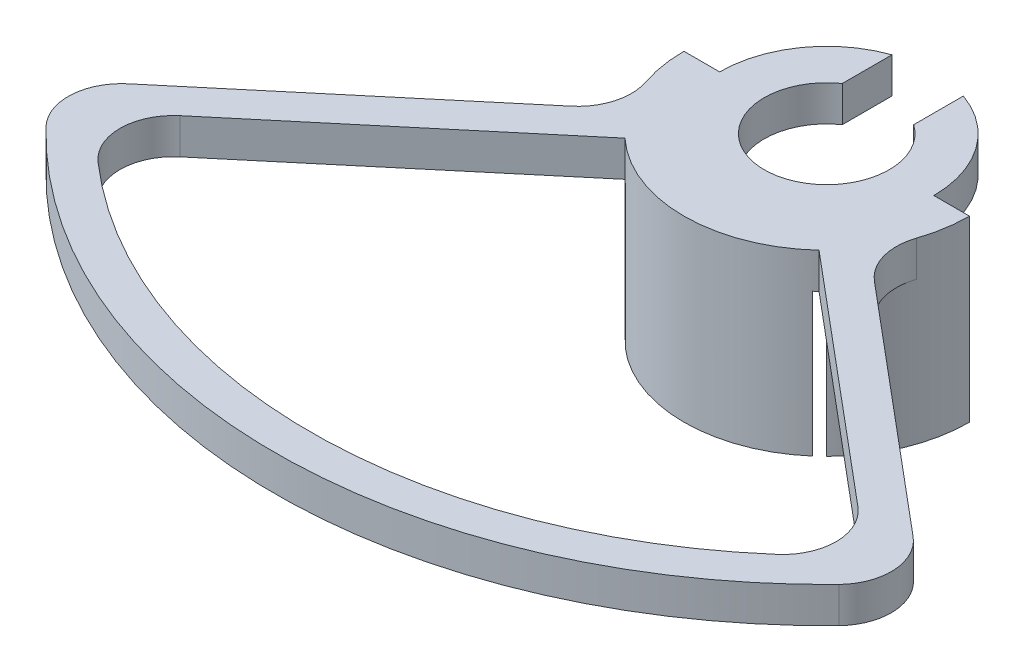
ISO-10303-21;
HEADER;
FILE_DESCRIPTION(('STEP AP214'),'2;1');
FILE_NAME('part.step','',(''),(''),'','','');
FILE_SCHEMA(('AUTOMOTIVE_DESIGN { 1 0 10303 214 1 1 1 1 }'));
ENDSEC;
DATA;
#1=APPLICATION_CONTEXT('core data for automotive mechanical design processes');
#2=APPLICATION_PROTOCOL_DEFINITION('international standard','automotive_design',2000,#1);
#3=PRODUCT_CONTEXT('',#1,'mechanical');
#4=PRODUCT('Part','Part','',(#3));
#5=PRODUCT_RELATED_PRODUCT_CATEGORY('part','',(#4));
#6=PRODUCT_DEFINITION_FORMATION('','',#4);
#7=PRODUCT_DEFINITION_CONTEXT('part definition',#1,'design');
#8=PRODUCT_DEFINITION('design','',#6,#7);
#9=PRODUCT_DEFINITION_SHAPE('','',#8);
#10=(LENGTH_UNIT() NAMED_UNIT(*) SI_UNIT(.MILLI.,.METRE.));
#11=(NAMED_UNIT(*) PLANE_ANGLE_UNIT() SI_UNIT($,.RADIAN.));
#12=(NAMED_UNIT(*) SI_UNIT($,.STERADIAN.) SOLID_ANGLE_UNIT());
#13=UNCERTAINTY_MEASURE_WITH_UNIT(LENGTH_MEASURE(1.E-05),#10,'distance_accuracy_value','');
#14=(GEOMETRIC_REPRESENTATION_CONTEXT(3) GLOBAL_UNCERTAINTY_ASSIGNED_CONTEXT((#13)) GLOBAL_UNIT_ASSIGNED_CONTEXT((#10,
#11,#12)) REPRESENTATION_CONTEXT('',''));
#15=CARTESIAN_POINT('',(0.,0.,0.));
#16=DIRECTION('',(0.,0.,1.));
#17=DIRECTION('',(1.,0.,0.));
#18=AXIS2_PLACEMENT_3D('',#15,#16,#17);
#19=CARTESIAN_POINT('',(-21.508214624942,2.,19.3529422484028));
#20=DIRECTION('',(0.642787609686538,0.,0.766044443118979));
#21=DIRECTION('',(0.766044443118979,0.,-0.642787609686538));
#22=AXIS2_PLACEMENT_3D('',#19,#20,#21);
#23=PLANE('',#22);
#24=DIRECTION('',(-0.766044443118979,0.,0.642787609686538));
#25=VECTOR('',#24,1.);
#26=CARTESIAN_POINT('',(-21.508214624942,2.,19.3529422484028));
#27=LINE('',#26,#25);
#28=CARTESIAN_POINT('',(-5.43750165946081,2.,5.86801292631168));
#29=VERTEX_POINT('',#28);
#30=CARTESIAN_POINT('',(-18.9855892592477,2.,17.2362082344503));
#31=VERTEX_POINT('',#30);
#32=EDGE_CURVE('E273',#29,#31,#27,.T.);
#33=ORIENTED_EDGE('',*,*,#32,.T.);
#34=DIRECTION('',(0.,1.,0.));
#35=VECTOR('',#34,1.);
#36=CARTESIAN_POINT('',(-18.9855892592477,0.,17.2362082344503));
#37=LINE('',#36,#35);
#38=CARTESIAN_POINT('',(-18.9855892592477,0.,17.2362082344503));
#39=VERTEX_POINT('',#38);
#40=EDGE_CURVE('E423',#31,#39,#37,.F.);
#41=ORIENTED_EDGE('',*,*,#40,.T.);
#42=DIRECTION('',(-0.766044443118979,0.,0.642787609686538));
#43=VECTOR('',#42,1.);
#44=CARTESIAN_POINT('',(-21.508214624942,0.,19.3529422484028));
#45=LINE('',#44,#43);
#46=CARTESIAN_POINT('',(-5.43750165946081,0.,5.86801292631168));
#47=VERTEX_POINT('',#46);
#48=EDGE_CURVE('E276',#47,#39,#45,.T.);
#49=ORIENTED_EDGE('',*,*,#48,.F.);
#50=DIRECTION('',(0.,-1.,0.));
#51=VECTOR('',#50,1.);
#52=CARTESIAN_POINT('',(-5.43750165946081,19.8885438199983,5.86801292631168));
#53=LINE('',#52,#51);
#54=EDGE_CURVE('E258',#47,#29,#53,.F.);
#55=ORIENTED_EDGE('',*,*,#54,.T.);
#56=EDGE_LOOP('',(#33,#41,#49,#55));
#57=FACE_BOUND('',#56,.T.);
#58=ADVANCED_FACE('F43',(#57),#23,.T.);
#59=CARTESIAN_POINT('',(21.508214624942,2.,19.3529422484028));
#60=DIRECTION('',(-0.642787609686538,0.,0.766044443118979));
#61=DIRECTION('',(0.766044443118979,0.,0.642787609686538));
#62=AXIS2_PLACEMENT_3D('',#59,#60,#61);
#63=PLANE('',#62);
#64=DIRECTION('',(-0.766044443118979,0.,-0.642787609686538));
#65=VECTOR('',#64,1.);
#66=CARTESIAN_POINT('',(21.508214624942,0.,19.3529422484028));
#67=LINE('',#66,#65);
#68=CARTESIAN_POINT('',(18.9855892592477,0.,17.2362082344503));
#69=VERTEX_POINT('',#68);
#70=CARTESIAN_POINT('',(5.43750165946081,0.,5.86801292631167));
#71=VERTEX_POINT('',#70);
#72=EDGE_CURVE('E285',#69,#71,#67,.T.);
#73=ORIENTED_EDGE('',*,*,#72,.F.);
#74=DIRECTION('',(0.,1.,0.));
#75=VECTOR('',#74,1.);
#76=CARTESIAN_POINT('',(18.9855892592477,2.,17.2362082344503));
#77=LINE('',#76,#75);
#78=CARTESIAN_POINT('',(18.9855892592477,2.,17.2362082344503));
#79=VERTEX_POINT('',#78);
#80=EDGE_CURVE('E433',#69,#79,#77,.T.);
#81=ORIENTED_EDGE('',*,*,#80,.T.);
#82=DIRECTION('',(-0.766044443118979,0.,-0.642787609686538));
#83=VECTOR('',#82,1.);
#84=CARTESIAN_POINT('',(21.508214624942,2.,19.3529422484028));
#85=LINE('',#84,#83);
#86=CARTESIAN_POINT('',(5.43750165946081,2.,5.86801292631167));
#87=VERTEX_POINT('',#86);
#88=EDGE_CURVE('E290',#79,#87,#85,.T.);
#89=ORIENTED_EDGE('',*,*,#88,.T.);
#90=DIRECTION('',(0.,-1.,0.));
#91=VECTOR('',#90,1.);
#92=CARTESIAN_POINT('',(5.43750165946081,19.8885438199983,5.86801292631167));
#93=LINE('',#92,#91);
#94=EDGE_CURVE('E262',#87,#71,#93,.T.);
#95=ORIENTED_EDGE('',*,*,#94,.T.);
#96=EDGE_LOOP('',(#73,#81,#89,#95));
#97=FACE_BOUND('',#96,.T.);
#98=ADVANCED_FACE('F685',(#97),#63,.T.);
#99=CARTESIAN_POINT('',(-3.74139683240488,13.0516361435528,4.56201158947133));
#100=DIRECTION('',(0.698202808595969,0.,0.715900019603786));
#101=DIRECTION('',(0.715900019603786,0.,-0.698202808595969));
#102=AXIS2_PLACEMENT_3D('',#99,#100,#101);
#103=PLANE('',#102);
#104=DIRECTION('',(0.,-1.,0.));
#105=VECTOR('',#104,1.);
#106=CARTESIAN_POINT('',(-5.25164015186098,13.0516361435528,6.0349213512159));
#107=LINE('',#106,#105);
#108=CARTESIAN_POINT('',(-5.25164015186098,0.,6.0349213512159));
#109=VERTEX_POINT('',#108);
#110=CARTESIAN_POINT('',(-5.25164015186098,-8.,6.0349213512159));
#111=VERTEX_POINT('',#110);
#112=EDGE_CURVE('E651',#109,#111,#107,.T.);
#113=ORIENTED_EDGE('',*,*,#112,.F.);
#114=DIRECTION('',(0.715900019603786,0.,-0.698202808595969));
#115=VECTOR('',#114,1.);
#116=CARTESIAN_POINT('',(0.456408480129121,0.,0.46797697724652));
#117=LINE('',#116,#115);
#118=CARTESIAN_POINT('',(-3.74139683240488,0.,4.56201158947133));
#119=VERTEX_POINT('',#118);
#120=EDGE_CURVE('E625',#109,#119,#117,.T.);
#121=ORIENTED_EDGE('',*,*,#120,.T.);
#122=DIRECTION('',(0.,-1.,0.));
#123=VECTOR('',#122,1.);
#124=CARTESIAN_POINT('',(-3.74139683240488,13.0516361435528,4.56201158947133));
#125=LINE('',#124,#123);
#126=CARTESIAN_POINT('',(-3.74139683240488,-8.,4.56201158947133));
#127=VERTEX_POINT('',#126);
#128=EDGE_CURVE('E648',#119,#127,#125,.T.);
#129=ORIENTED_EDGE('',*,*,#128,.T.);
#130=DIRECTION('',(-0.715900019603786,0.,0.698202808595969));
#131=VECTOR('',#130,1.);
#132=CARTESIAN_POINT('',(-3.74139683240488,-8.,4.56201158947133));
#133=LINE('',#132,#131);
#134=EDGE_CURVE('E635',#127,#111,#133,.T.);
#135=ORIENTED_EDGE('',*,*,#134,.T.);
#136=EDGE_LOOP('',(#113,#121,#129,#135));
#137=FACE_BOUND('',#136,.T.);
#138=ADVANCED_FACE('F669',(#137),#103,.F.);
#139=CARTESIAN_POINT('',(3.74139683240488,13.0516361435528,4.56201158947133));
#140=DIRECTION('',(-0.698202808595969,0.,0.715900019603786));
#141=DIRECTION('',(0.715900019603786,0.,0.698202808595969));
#142=AXIS2_PLACEMENT_3D('',#139,#140,#141);
#143=PLANE('',#142);
#144=DIRECTION('',(0.715900019603786,0.,0.698202808595969));
#145=VECTOR('',#144,1.);
#146=CARTESIAN_POINT('',(-0.456408480129121,0.,0.46797697724652));
#147=LINE('',#146,#145);
#148=CARTESIAN_POINT('',(3.74139683240488,0.,4.56201158947133));
#149=VERTEX_POINT('',#148);
#150=CARTESIAN_POINT('',(5.25164015186098,0.,6.0349213512159));
#151=VERTEX_POINT('',#150);
#152=EDGE_CURVE('E628',#149,#151,#147,.T.);
#153=ORIENTED_EDGE('',*,*,#152,.T.);
#154=DIRECTION('',(0.,-1.,0.));
#155=VECTOR('',#154,1.);
#156=CARTESIAN_POINT('',(5.25164015186098,13.0516361435528,6.0349213512159));
#157=LINE('',#156,#155);
#158=CARTESIAN_POINT('',(5.25164015186098,-8.,6.0349213512159));
#159=VERTEX_POINT('',#158);
#160=EDGE_CURVE('E267',#151,#159,#157,.T.);
#161=ORIENTED_EDGE('',*,*,#160,.T.);
#162=DIRECTION('',(-0.715900019603786,0.,-0.698202808595969));
#163=VECTOR('',#162,1.);
#164=CARTESIAN_POINT('',(3.74139683240488,-8.,4.56201158947133));
#165=LINE('',#164,#163);
#166=CARTESIAN_POINT('',(3.74139683240488,-8.,4.56201158947133));
#167=VERTEX_POINT('',#166);
#168=EDGE_CURVE('E643',#159,#167,#165,.T.);
#169=ORIENTED_EDGE('',*,*,#168,.T.);
#170=DIRECTION('',(0.,-1.,0.));
#171=VECTOR('',#170,1.);
#172=CARTESIAN_POINT('',(3.74139683240488,13.0516361435528,4.56201158947133));
#173=LINE('',#172,#171);
#174=EDGE_CURVE('E646',#149,#167,#173,.T.);
#175=ORIENTED_EDGE('',*,*,#174,.F.);
#176=EDGE_LOOP('',(#153,#161,#169,#175));
#177=FACE_BOUND('',#176,.T.);
#178=ADVANCED_FACE('F681',(#177),#143,.F.);
#179=CARTESIAN_POINT('',(0.,0.,0.));
#180=DIRECTION('',(0.,1.,0.));
#181=DIRECTION('',(0.,0.,1.));
#182=AXIS2_PLACEMENT_3D('',#179,#180,#181);
#183=PLANE('',#182);
#184=DIRECTION('',(-0.766044443118979,0.,-0.642787609686537));
#185=VECTOR('',#184,1.);
#186=CARTESIAN_POINT('',(24.325878730553,0.,19.1064285815379));
#187=LINE('',#186,#185);
#188=CARTESIAN_POINT('',(21.9852105926654,0.,17.142374810328));
#189=VERTEX_POINT('',#188);
#190=CARTESIAN_POINT('',(8.49240730286366,0.,5.82056854630783));
#191=VERTEX_POINT('',#190);
#192=EDGE_CURVE('E347',#189,#191,#187,.T.);
#193=ORIENTED_EDGE('',*,*,#192,.F.);
#194=CARTESIAN_POINT('',(20.0568477636058,0.,19.4405081396849));
#195=DIRECTION('',(0.,1.,0.));
#196=DIRECTION('',(0.,0.,1.));
#197=AXIS2_PLACEMENT_3D('',#194,#195,#196);
#198=CIRCLE('',#197,3.);
#199=CARTESIAN_POINT('',(22.2110081625883,0.,21.5284719744904));
#200=VERTEX_POINT('',#199);
#201=EDGE_CURVE('E401',#189,#200,#198,.F.);
#202=ORIENTED_EDGE('',*,*,#201,.T.);
#203=CARTESIAN_POINT('',(0.,0.,0.));
#204=DIRECTION('',(0.,1.,0.));
#205=DIRECTION('',(0.,0.,1.));
#206=AXIS2_PLACEMENT_3D('',#203,#204,#205);
#207=CIRCLE('',#206,30.9322483688946);
#208=CARTESIAN_POINT('',(-22.2110081625883,0.,21.5284719744904));
#209=VERTEX_POINT('',#208);
#210=EDGE_CURVE('E343',#209,#200,#207,.T.);
#211=ORIENTED_EDGE('',*,*,#210,.F.);
#212=CARTESIAN_POINT('',(-20.0568477636058,0.,19.4405081396849));
#213=DIRECTION('',(0.,1.,0.));
#214=DIRECTION('',(0.,0.,1.));
#215=AXIS2_PLACEMENT_3D('',#212,#213,#214);
#216=CIRCLE('',#215,3.);
#217=CARTESIAN_POINT('',(-21.9852105926654,0.,17.142374810328));
#218=VERTEX_POINT('',#217);
#219=EDGE_CURVE('E398',#209,#218,#216,.F.);
#220=ORIENTED_EDGE('',*,*,#219,.T.);
#221=DIRECTION('',(-0.766044443118979,0.,0.642787609686538));
#222=VECTOR('',#221,1.);
#223=CARTESIAN_POINT('',(-24.325878730553,0.,19.1064285815379));
#224=LINE('',#223,#222);
#225=CARTESIAN_POINT('',(-8.49240730286366,0.,5.82056854630784));
#226=VERTEX_POINT('',#225);
#227=EDGE_CURVE('E339',#226,#218,#224,.T.);
#228=ORIENTED_EDGE('',*,*,#227,.F.);
#229=CARTESIAN_POINT('',(-10.4207701319233,0.,3.5224352169509));
#230=DIRECTION('',(0.,1.,0.));
#231=DIRECTION('',(0.,0.,1.));
#232=AXIS2_PLACEMENT_3D('',#229,#230,#231);
#233=CIRCLE('',#232,3.);
#234=CARTESIAN_POINT('',(-7.57874191412601,0.,2.56177106687338));
#235=VERTEX_POINT('',#234);
#236=EDGE_CURVE('E457',#226,#235,#233,.T.);
#237=ORIENTED_EDGE('',*,*,#236,.T.);
#238=CARTESIAN_POINT('',(0.,0.,0.));
#239=DIRECTION('',(0.,1.,0.));
#240=DIRECTION('',(0.,0.,1.));
#241=AXIS2_PLACEMENT_3D('',#238,#239,#240);
#242=CIRCLE('',#241,8.);
#243=CARTESIAN_POINT('',(-5.65388468775152,0.,5.65982225318153));
#244=VERTEX_POINT('',#243);
#245=EDGE_CURVE('E67',#244,#235,#242,.F.);
#246=ORIENTED_EDGE('',*,*,#245,.F.);
#247=DIRECTION('',(-0.646563360724868,0.,0.762860289022941));
#248=VECTOR('',#247,1.);
#249=CARTESIAN_POINT('',(-0.498674455011106,0.,-0.422652268284379));
#250=LINE('',#249,#248);
#251=CARTESIAN_POINT('',(-4.28991210861926,0.,4.05051281942446));
#252=VERTEX_POINT('',#251);
#253=EDGE_CURVE('E384',#252,#244,#250,.T.);
#254=ORIENTED_EDGE('',*,*,#253,.F.);
#255=CARTESIAN_POINT('',(0.,0.,0.));
#256=DIRECTION('',(0.,1.,0.));
#257=DIRECTION('',(0.,0.,1.));
#258=AXIS2_PLACEMENT_3D('',#255,#256,#257);
#259=CIRCLE('',#258,5.9);
#260=CARTESIAN_POINT('',(-5.9,0.,0.));
#261=VERTEX_POINT('',#260);
#262=EDGE_CURVE('E381',#261,#252,#259,.T.);
#263=ORIENTED_EDGE('',*,*,#262,.F.);
#264=DIRECTION('',(1.,0.,0.));
#265=VECTOR('',#264,1.);
#266=CARTESIAN_POINT('',(0.,0.,0.));
#267=LINE('',#266,#265);
#268=CARTESIAN_POINT('',(-6.,0.,0.));
#269=VERTEX_POINT('',#268);
#270=EDGE_CURVE('E295',#269,#261,#267,.T.);
#271=ORIENTED_EDGE('',*,*,#270,.F.);
#272=CARTESIAN_POINT('',(0.,0.,0.));
#273=DIRECTION('',(0.,1.,0.));
#274=DIRECTION('',(0.,0.,1.));
#275=AXIS2_PLACEMENT_3D('',#272,#273,#274);
#276=CIRCLE('',#275,6.);
#277=CARTESIAN_POINT('',(-2.,0.,-5.65685424949238));
#278=VERTEX_POINT('',#277);
#279=EDGE_CURVE('E300',#278,#269,#276,.T.);
#280=ORIENTED_EDGE('',*,*,#279,.F.);
#281=DIRECTION('',(0.,0.,-1.));
#282=VECTOR('',#281,1.);
#283=CARTESIAN_POINT('',(-2.,0.,-2.87228132326902));
#284=LINE('',#283,#282);
#285=CARTESIAN_POINT('',(-2.,0.,-2.87228132326902));
#286=VERTEX_POINT('',#285);
#287=EDGE_CURVE('E311',#286,#278,#284,.T.);
#288=ORIENTED_EDGE('',*,*,#287,.F.);
#289=CARTESIAN_POINT('',(0.,0.,0.));
#290=DIRECTION('',(0.,-1.,0.));
#291=DIRECTION('',(0.,0.,-1.));
#292=AXIS2_PLACEMENT_3D('',#289,#290,#291);
#293=CIRCLE('',#292,3.5);
#294=CARTESIAN_POINT('',(2.,0.,-2.87228132326901));
#295=VERTEX_POINT('',#294);
#296=EDGE_CURVE('E357',#295,#286,#293,.T.);
#297=ORIENTED_EDGE('',*,*,#296,.F.);
#298=DIRECTION('',(0.,0.,1.));
#299=VECTOR('',#298,1.);
#300=CARTESIAN_POINT('',(2.,0.,-2.87228132326902));
#301=LINE('',#300,#299);
#302=CARTESIAN_POINT('',(2.,0.,-5.65685424949238));
#303=VERTEX_POINT('',#302);
#304=EDGE_CURVE('E354',#303,#295,#301,.T.);
#305=ORIENTED_EDGE('',*,*,#304,.F.);
#306=CARTESIAN_POINT('',(0.,0.,0.));
#307=DIRECTION('',(0.,1.,0.));
#308=DIRECTION('',(0.,0.,1.));
#309=AXIS2_PLACEMENT_3D('',#306,#307,#308);
#310=CIRCLE('',#309,6.);
#311=CARTESIAN_POINT('',(6.,0.,0.));
#312=VERTEX_POINT('',#311);
#313=EDGE_CURVE('E351',#312,#303,#310,.T.);
#314=ORIENTED_EDGE('',*,*,#313,.F.);
#315=DIRECTION('',(1.,0.,0.));
#316=VECTOR('',#315,1.);
#317=CARTESIAN_POINT('',(0.,0.,0.));
#318=LINE('',#317,#316);
#319=CARTESIAN_POINT('',(5.9,0.,0.));
#320=VERTEX_POINT('',#319);
#321=EDGE_CURVE('E509',#320,#312,#318,.T.);
#322=ORIENTED_EDGE('',*,*,#321,.F.);
#323=CARTESIAN_POINT('',(0.,0.,0.));
#324=DIRECTION('',(0.,1.,0.));
#325=DIRECTION('',(0.,0.,1.));
#326=AXIS2_PLACEMENT_3D('',#323,#324,#325);
#327=CIRCLE('',#326,5.9);
#328=CARTESIAN_POINT('',(4.28991210861926,0.,4.05051281942446));
#329=VERTEX_POINT('',#328);
#330=EDGE_CURVE('E517',#329,#320,#327,.T.);
#331=ORIENTED_EDGE('',*,*,#330,.F.);
#332=DIRECTION('',(-0.646563360724868,0.,-0.762860289022941));
#333=VECTOR('',#332,1.);
#334=CARTESIAN_POINT('',(0.498674455011106,0.,-0.422652268284379));
#335=LINE('',#334,#333);
#336=CARTESIAN_POINT('',(5.65388468775152,0.,5.65982225318153));
#337=VERTEX_POINT('',#336);
#338=EDGE_CURVE('E514',#337,#329,#335,.T.);
#339=ORIENTED_EDGE('',*,*,#338,.F.);
#340=CARTESIAN_POINT('',(0.,0.,0.));
#341=DIRECTION('',(0.,1.,0.));
#342=DIRECTION('',(0.,0.,1.));
#343=AXIS2_PLACEMENT_3D('',#340,#341,#342);
#344=CIRCLE('',#343,8.);
#345=CARTESIAN_POINT('',(7.57874191412602,0.,2.56177106687337));
#346=VERTEX_POINT('',#345);
#347=EDGE_CURVE('E59',#346,#337,#344,.F.);
#348=ORIENTED_EDGE('',*,*,#347,.F.);
#349=CARTESIAN_POINT('',(10.4207701319233,0.,3.52243521695089));
#350=DIRECTION('',(0.,1.,0.));
#351=DIRECTION('',(0.,0.,1.));
#352=AXIS2_PLACEMENT_3D('',#349,#350,#351);
#353=CIRCLE('',#352,3.);
#354=EDGE_CURVE('E52',#346,#191,#353,.T.);
#355=ORIENTED_EDGE('',*,*,#354,.T.);
#356=EDGE_LOOP('',(#193,#202,#211,#220,#228,#237,#246,#254,#263,#271,#280,#288,#297,#305,#314,
#322,#331,#339,#348,#355));
#357=FACE_BOUND('',#356,.T.);
#358=CARTESIAN_POINT('',(0.,0.,0.));
#359=DIRECTION('',(0.,1.,0.));
#360=DIRECTION('',(0.,0.,1.));
#361=AXIS2_PLACEMENT_3D('',#358,#359,#360);
#362=CIRCLE('',#361,8.);
#363=EDGE_CURVE('E661',#151,#71,#362,.T.);
#364=ORIENTED_EDGE('',*,*,#363,.F.);
#365=ORIENTED_EDGE('',*,*,#152,.F.);
#366=CARTESIAN_POINT('',(0.,0.,0.));
#367=DIRECTION('',(0.,1.,0.));
#368=DIRECTION('',(0.,0.,1.));
#369=AXIS2_PLACEMENT_3D('',#366,#367,#368);
#370=CIRCLE('',#369,5.9);
#371=EDGE_CURVE('E488',#119,#149,#370,.T.);
#372=ORIENTED_EDGE('',*,*,#371,.F.);
#373=ORIENTED_EDGE('',*,*,#120,.F.);
#374=EDGE_CURVE('E660',#47,#109,#362,.T.);
#375=ORIENTED_EDGE('',*,*,#374,.F.);
#376=ORIENTED_EDGE('',*,*,#48,.T.);
#377=CARTESIAN_POINT('',(-17.0572264301881,0.,19.5343415638073));
#378=DIRECTION('',(0.,1.,0.));
#379=DIRECTION('',(0.,0.,1.));
#380=AXIS2_PLACEMENT_3D('',#377,#378,#379);
#381=CIRCLE('',#380,3.);
#382=CARTESIAN_POINT('',(-19.0304249430485,0.,21.7940954505935));
#383=VERTEX_POINT('',#382);
#384=EDGE_CURVE('E443',#39,#383,#381,.T.);
#385=ORIENTED_EDGE('',*,*,#384,.T.);
#386=CARTESIAN_POINT('',(0.,0.,0.));
#387=DIRECTION('',(0.,1.,0.));
#388=DIRECTION('',(0.,0.,1.));
#389=AXIS2_PLACEMENT_3D('',#386,#387,#388);
#390=CIRCLE('',#389,28.9333660333979);
#391=CARTESIAN_POINT('',(19.0304249430485,0.,21.7940954505935));
#392=VERTEX_POINT('',#391);
#393=EDGE_CURVE('E292',#383,#392,#390,.T.);
#394=ORIENTED_EDGE('',*,*,#393,.T.);
#395=CARTESIAN_POINT('',(17.0572264301881,0.,19.5343415638073));
#396=DIRECTION('',(0.,1.,0.));
#397=DIRECTION('',(0.,0.,1.));
#398=AXIS2_PLACEMENT_3D('',#395,#396,#397);
#399=CIRCLE('',#398,3.);
#400=EDGE_CURVE('E448',#392,#69,#399,.T.);
#401=ORIENTED_EDGE('',*,*,#400,.T.);
#402=ORIENTED_EDGE('',*,*,#72,.T.);
#403=EDGE_LOOP('',(#364,#365,#372,#373,#375,#376,#385,#394,#401,#402));
#404=FACE_BOUND('',#403,.T.);
#405=ADVANCED_FACE('F461',(#357,#404),#183,.F.);
#406=CARTESIAN_POINT('',(24.325878730553,2.,19.1064285815379));
#407=DIRECTION('',(-0.642787609686538,0.,0.76604444311898));
#408=DIRECTION('',(0.766044443118979,0.,0.642787609686538));
#409=AXIS2_PLACEMENT_3D('',#406,#407,#408);
#410=PLANE('',#409);
#411=DIRECTION('',(-0.766044443118979,0.,-0.642787609686537));
#412=VECTOR('',#411,1.);
#413=CARTESIAN_POINT('',(24.325878730553,2.,19.1064285815379));
#414=LINE('',#413,#412);
#415=CARTESIAN_POINT('',(21.9852105926654,2.,17.142374810328));
#416=VERTEX_POINT('',#415);
#417=CARTESIAN_POINT('',(8.49240730286366,2.,5.82056854630783));
#418=VERTEX_POINT('',#417);
#419=EDGE_CURVE('E319',#416,#418,#414,.T.);
#420=ORIENTED_EDGE('',*,*,#419,.F.);
#421=DIRECTION('',(0.,-1.,0.));
#422=VECTOR('',#421,1.);
#423=CARTESIAN_POINT('',(21.9852105926654,2.,17.142374810328));
#424=LINE('',#423,#422);
#425=EDGE_CURVE('E394',#416,#189,#424,.T.);
#426=ORIENTED_EDGE('',*,*,#425,.T.);
#427=ORIENTED_EDGE('',*,*,#192,.T.);
#428=DIRECTION('',(0.,1.,0.));
#429=VECTOR('',#428,1.);
#430=CARTESIAN_POINT('',(8.49240730286366,2.,5.82056854630783));
#431=LINE('',#430,#429);
#432=EDGE_CURVE('E391',#191,#418,#431,.T.);
#433=ORIENTED_EDGE('',*,*,#432,.T.);
#434=EDGE_LOOP('',(#420,#426,#427,#433));
#435=FACE_BOUND('',#434,.T.);
#436=ADVANCED_FACE('F468',(#435),#410,.F.);
#437=CARTESIAN_POINT('',(0.,2.,0.));
#438=DIRECTION('',(0.,-1.,0.));
#439=DIRECTION('',(0.,0.,-1.));
#440=AXIS2_PLACEMENT_3D('',#437,#438,#439);
#441=CYLINDRICAL_SURFACE('',#440,6.);
#442=DIRECTION('',(0.,-1.,0.));
#443=VECTOR('',#442,1.);
#444=CARTESIAN_POINT('',(6.,2.,0.));
#445=LINE('',#444,#443);
#446=CARTESIAN_POINT('',(6.,2.,0.));
#447=VERTEX_POINT('',#446);
#448=EDGE_CURVE('E387',#312,#447,#445,.F.);
#449=ORIENTED_EDGE('',*,*,#448,.F.);
#450=ORIENTED_EDGE('',*,*,#313,.T.);
#451=DIRECTION('',(0.,-1.,0.));
#452=VECTOR('',#451,1.);
#453=CARTESIAN_POINT('',(2.,2.,-5.65685424949238));
#454=LINE('',#453,#452);
#455=CARTESIAN_POINT('',(2.,2.,-5.65685424949238));
#456=VERTEX_POINT('',#455);
#457=EDGE_CURVE('E374',#456,#303,#454,.T.);
#458=ORIENTED_EDGE('',*,*,#457,.F.);
#459=CARTESIAN_POINT('',(0.,2.,0.));
#460=DIRECTION('',(0.,1.,0.));
#461=DIRECTION('',(0.,0.,1.));
#462=AXIS2_PLACEMENT_3D('',#459,#460,#461);
#463=CIRCLE('',#462,6.);
#464=EDGE_CURVE('E323',#447,#456,#463,.T.);
#465=ORIENTED_EDGE('',*,*,#464,.F.);
#466=EDGE_LOOP('',(#449,#450,#458,#465));
#467=FACE_BOUND('',#466,.T.);
#468=ADVANCED_FACE('F603',(#467),#441,.T.);
#469=CARTESIAN_POINT('',(0.,2.,0.));
#470=DIRECTION('',(0.,-1.,0.));
#471=DIRECTION('',(0.,0.,-1.));
#472=AXIS2_PLACEMENT_3D('',#469,#470,#471);
#473=CYLINDRICAL_SURFACE('',#472,6.);
#474=DIRECTION('',(0.,-1.,0.));
#475=VECTOR('',#474,1.);
#476=CARTESIAN_POINT('',(-6.,2.,0.));
#477=LINE('',#476,#475);
#478=CARTESIAN_POINT('',(-6.,2.,0.));
#479=VERTEX_POINT('',#478);
#480=EDGE_CURVE('E378',#479,#269,#477,.T.);
#481=ORIENTED_EDGE('',*,*,#480,.F.);
#482=CARTESIAN_POINT('',(0.,2.,0.));
#483=DIRECTION('',(0.,1.,0.));
#484=DIRECTION('',(0.,0.,1.));
#485=AXIS2_PLACEMENT_3D('',#482,#483,#484);
#486=CIRCLE('',#485,6.);
#487=CARTESIAN_POINT('',(-2.,2.,-5.65685424949238));
#488=VERTEX_POINT('',#487);
#489=EDGE_CURVE('E306',#488,#479,#486,.T.);
#490=ORIENTED_EDGE('',*,*,#489,.F.);
#491=DIRECTION('',(0.,-1.,0.));
#492=VECTOR('',#491,1.);
#493=CARTESIAN_POINT('',(-2.,2.,-5.65685424949238));
#494=LINE('',#493,#492);
#495=EDGE_CURVE('E335',#488,#278,#494,.T.);
#496=ORIENTED_EDGE('',*,*,#495,.T.);
#497=ORIENTED_EDGE('',*,*,#279,.T.);
#498=EDGE_LOOP('',(#481,#490,#496,#497));
#499=FACE_BOUND('',#498,.T.);
#500=ADVANCED_FACE('F583',(#499),#473,.T.);
#501=CARTESIAN_POINT('',(-24.325878730553,2.,19.1064285815379));
#502=DIRECTION('',(0.642787609686538,0.,0.766044443118979));
#503=DIRECTION('',(0.766044443118979,0.,-0.642787609686538));
#504=AXIS2_PLACEMENT_3D('',#501,#502,#503);
#505=PLANE('',#504);
#506=ORIENTED_EDGE('',*,*,#227,.T.);
#507=DIRECTION('',(0.,-1.,0.));
#508=VECTOR('',#507,1.);
#509=CARTESIAN_POINT('',(-21.9852105926654,2.,17.142374810328));
#510=LINE('',#509,#508);
#511=CARTESIAN_POINT('',(-21.9852105926654,2.,17.142374810328));
#512=VERTEX_POINT('',#511);
#513=EDGE_CURVE('E420',#218,#512,#510,.F.);
#514=ORIENTED_EDGE('',*,*,#513,.T.);
#515=DIRECTION('',(-0.766044443118979,0.,0.642787609686538));
#516=VECTOR('',#515,1.);
#517=CARTESIAN_POINT('',(-24.325878730553,2.,19.1064285815379));
#518=LINE('',#517,#516);
#519=CARTESIAN_POINT('',(-8.49240730286366,2.,5.82056854630784));
#520=VERTEX_POINT('',#519);
#521=EDGE_CURVE('E310',#520,#512,#518,.T.);
#522=ORIENTED_EDGE('',*,*,#521,.F.);
#523=DIRECTION('',(0.,1.,0.));
#524=VECTOR('',#523,1.);
#525=CARTESIAN_POINT('',(-8.49240730286365,0.,5.82056854630784));
#526=LINE('',#525,#524);
#527=EDGE_CURVE('E417',#520,#226,#526,.F.);
#528=ORIENTED_EDGE('',*,*,#527,.T.);
#529=EDGE_LOOP('',(#506,#514,#522,#528));
#530=FACE_BOUND('',#529,.T.);
#531=ADVANCED_FACE('F719',(#530),#505,.F.);
#532=CARTESIAN_POINT('',(0.,2.,0.));
#533=DIRECTION('',(0.,1.,0.));
#534=DIRECTION('',(0.,0.,1.));
#535=AXIS2_PLACEMENT_3D('',#532,#533,#534);
#536=PLANE('',#535);
#537=CARTESIAN_POINT('',(0.,2.,0.));
#538=DIRECTION('',(0.,1.,0.));
#539=DIRECTION('',(0.,0.,1.));
#540=AXIS2_PLACEMENT_3D('',#537,#538,#539);
#541=CIRCLE('',#540,30.9322483688946);
#542=CARTESIAN_POINT('',(-22.2110081625883,2.,21.5284719744904));
#543=VERTEX_POINT('',#542);
#544=CARTESIAN_POINT('',(22.2110081625883,2.,21.5284719744904));
#545=VERTEX_POINT('',#544);
#546=EDGE_CURVE('E315',#543,#545,#541,.T.);
#547=ORIENTED_EDGE('',*,*,#546,.T.);
#548=CARTESIAN_POINT('',(20.0568477636058,2.,19.4405081396849));
#549=DIRECTION('',(0.,1.,0.));
#550=DIRECTION('',(0.,0.,1.));
#551=AXIS2_PLACEMENT_3D('',#548,#549,#550);
#552=CIRCLE('',#551,3.);
#553=EDGE_CURVE('E414',#545,#416,#552,.T.);
#554=ORIENTED_EDGE('',*,*,#553,.T.);
#555=ORIENTED_EDGE('',*,*,#419,.T.);
#556=CARTESIAN_POINT('',(10.4207701319233,2.,3.52243521695089));
#557=DIRECTION('',(0.,1.,0.));
#558=DIRECTION('',(0.,0.,1.));
#559=AXIS2_PLACEMENT_3D('',#556,#557,#558);
#560=CIRCLE('',#559,3.);
#561=CARTESIAN_POINT('',(7.57874191412602,2.,2.56177106687337));
#562=VERTEX_POINT('',#561);
#563=EDGE_CURVE('E11',#418,#562,#560,.F.);
#564=ORIENTED_EDGE('',*,*,#563,.T.);
#565=CARTESIAN_POINT('',(0.,2.,0.));
#566=DIRECTION('',(0.,1.,0.));
#567=DIRECTION('',(0.,0.,1.));
#568=AXIS2_PLACEMENT_3D('',#565,#566,#567);
#569=CIRCLE('',#568,8.);
#570=CARTESIAN_POINT('',(8.,2.,0.));
#571=VERTEX_POINT('',#570);
#572=EDGE_CURVE('E473',#562,#571,#569,.T.);
#573=ORIENTED_EDGE('',*,*,#572,.T.);
#574=DIRECTION('',(-1.,0.,0.));
#575=VECTOR('',#574,1.);
#576=CARTESIAN_POINT('',(8.,2.,0.));
#577=LINE('',#576,#575);
#578=EDGE_CURVE('E482',#571,#447,#577,.T.);
#579=ORIENTED_EDGE('',*,*,#578,.T.);
#580=ORIENTED_EDGE('',*,*,#464,.T.);
#581=DIRECTION('',(0.,0.,1.));
#582=VECTOR('',#581,1.);
#583=CARTESIAN_POINT('',(2.,2.,-2.87228132326902));
#584=LINE('',#583,#582);
#585=CARTESIAN_POINT('',(2.,2.,-2.87228132326901));
#586=VERTEX_POINT('',#585);
#587=EDGE_CURVE('E326',#456,#586,#584,.T.);
#588=ORIENTED_EDGE('',*,*,#587,.T.);
#589=CARTESIAN_POINT('',(0.,2.,0.));
#590=DIRECTION('',(0.,-1.,0.));
#591=DIRECTION('',(0.,0.,-1.));
#592=AXIS2_PLACEMENT_3D('',#589,#590,#591);
#593=CIRCLE('',#592,3.5);
#594=CARTESIAN_POINT('',(-2.,2.,-2.87228132326902));
#595=VERTEX_POINT('',#594);
#596=EDGE_CURVE('E329',#586,#595,#593,.T.);
#597=ORIENTED_EDGE('',*,*,#596,.T.);
#598=DIRECTION('',(0.,0.,-1.));
#599=VECTOR('',#598,1.);
#600=CARTESIAN_POINT('',(-2.,2.,-2.87228132326902));
#601=LINE('',#600,#599);
#602=EDGE_CURVE('E332',#595,#488,#601,.T.);
#603=ORIENTED_EDGE('',*,*,#602,.T.);
#604=ORIENTED_EDGE('',*,*,#489,.T.);
#605=DIRECTION('',(-1.,0.,0.));
#606=VECTOR('',#605,1.);
#607=CARTESIAN_POINT('',(-8.,2.,0.));
#608=LINE('',#607,#606);
#609=CARTESIAN_POINT('',(-8.,2.,0.));
#610=VERTEX_POINT('',#609);
#611=EDGE_CURVE('E541',#479,#610,#608,.T.);
#612=ORIENTED_EDGE('',*,*,#611,.T.);
#613=CARTESIAN_POINT('',(0.,2.,0.));
#614=DIRECTION('',(0.,1.,0.));
#615=DIRECTION('',(0.,0.,1.));
#616=AXIS2_PLACEMENT_3D('',#613,#614,#615);
#617=CIRCLE('',#616,8.);
#618=CARTESIAN_POINT('',(-7.57874191412601,2.,2.56177106687338));
#619=VERTEX_POINT('',#618);
#620=EDGE_CURVE('E537',#610,#619,#617,.T.);
#621=ORIENTED_EDGE('',*,*,#620,.T.);
#622=CARTESIAN_POINT('',(-10.4207701319233,2.,3.5224352169509));
#623=DIRECTION('',(0.,1.,0.));
#624=DIRECTION('',(0.,0.,1.));
#625=AXIS2_PLACEMENT_3D('',#622,#623,#624);
#626=CIRCLE('',#625,3.);
#627=EDGE_CURVE('E454',#619,#520,#626,.F.);
#628=ORIENTED_EDGE('',*,*,#627,.T.);
#629=ORIENTED_EDGE('',*,*,#521,.T.);
#630=CARTESIAN_POINT('',(-20.0568477636058,2.,19.4405081396849));
#631=DIRECTION('',(0.,1.,0.));
#632=DIRECTION('',(0.,0.,1.));
#633=AXIS2_PLACEMENT_3D('',#630,#631,#632);
#634=CIRCLE('',#633,3.);
#635=EDGE_CURVE('E411',#512,#543,#634,.T.);
#636=ORIENTED_EDGE('',*,*,#635,.T.);
#637=EDGE_LOOP('',(#547,#554,#555,#564,#573,#579,#580,#588,#597,#603,#604,#612,#621,#628,#629,#636));
#638=FACE_BOUND('',#637,.T.);
#639=ORIENTED_EDGE('',*,*,#32,.F.);
#640=CARTESIAN_POINT('',(0.,2.,0.));
#641=DIRECTION('',(0.,1.,0.));
#642=DIRECTION('',(0.,0.,1.));
#643=AXIS2_PLACEMENT_3D('',#640,#641,#642);
#644=CIRCLE('',#643,8.);
#645=EDGE_CURVE('E254',#29,#87,#644,.T.);
#646=ORIENTED_EDGE('',*,*,#645,.T.);
#647=ORIENTED_EDGE('',*,*,#88,.F.);
#648=CARTESIAN_POINT('',(17.0572264301881,2.,19.5343415638073));
#649=DIRECTION('',(0.,1.,0.));
#650=DIRECTION('',(0.,0.,1.));
#651=AXIS2_PLACEMENT_3D('',#648,#649,#650);
#652=CIRCLE('',#651,3.);
#653=CARTESIAN_POINT('',(19.0304249430485,2.,21.7940954505935));
#654=VERTEX_POINT('',#653);
#655=EDGE_CURVE('E451',#79,#654,#652,.F.);
#656=ORIENTED_EDGE('',*,*,#655,.T.);
#657=CARTESIAN_POINT('',(0.,2.,0.));
#658=DIRECTION('',(0.,1.,0.));
#659=DIRECTION('',(0.,0.,1.));
#660=AXIS2_PLACEMENT_3D('',#657,#658,#659);
#661=CIRCLE('',#660,28.9333660333979);
#662=CARTESIAN_POINT('',(-19.0304249430485,2.,21.7940954505935));
#663=VERTEX_POINT('',#662);
#664=EDGE_CURVE('E284',#663,#654,#661,.T.);
#665=ORIENTED_EDGE('',*,*,#664,.F.);
#666=CARTESIAN_POINT('',(-17.0572264301881,2.,19.5343415638073));
#667=DIRECTION('',(0.,1.,0.));
#668=DIRECTION('',(0.,0.,1.));
#669=AXIS2_PLACEMENT_3D('',#666,#667,#668);
#670=CIRCLE('',#669,3.);
#671=EDGE_CURVE('E282',#663,#31,#670,.F.);
#672=ORIENTED_EDGE('',*,*,#671,.T.);
#673=EDGE_LOOP('',(#639,#646,#647,#656,#665,#672));
#674=FACE_BOUND('',#673,.T.);
#675=ADVANCED_FACE('F279',(#638,#674),#536,.T.);
#676=CARTESIAN_POINT('',(0.,2.,0.));
#677=DIRECTION('',(0.,-1.,0.));
#678=DIRECTION('',(0.,0.,-1.));
#679=AXIS2_PLACEMENT_3D('',#676,#677,#678);
#680=CYLINDRICAL_SURFACE('',#679,30.9322483688946);
#681=ORIENTED_EDGE('',*,*,#210,.T.);
#682=DIRECTION('',(0.,-1.,0.));
#683=VECTOR('',#682,1.);
#684=CARTESIAN_POINT('',(22.2110081625883,2.,21.5284719744904));
#685=LINE('',#684,#683);
#686=EDGE_CURVE('E408',#200,#545,#685,.F.);
#687=ORIENTED_EDGE('',*,*,#686,.T.);
#688=ORIENTED_EDGE('',*,*,#546,.F.);
#689=DIRECTION('',(0.,-1.,0.));
#690=VECTOR('',#689,1.);
#691=CARTESIAN_POINT('',(-22.2110081625883,2.,21.5284719744904));
#692=LINE('',#691,#690);
#693=EDGE_CURVE('E404',#543,#209,#692,.T.);
#694=ORIENTED_EDGE('',*,*,#693,.T.);
#695=EDGE_LOOP('',(#681,#687,#688,#694));
#696=FACE_BOUND('',#695,.T.);
#697=ADVANCED_FACE('F718',(#696),#680,.T.);
#698=CARTESIAN_POINT('',(2.,2.,-2.87228132326902));
#699=DIRECTION('',(1.,0.,0.));
#700=DIRECTION('',(0.,0.,-1.));
#701=AXIS2_PLACEMENT_3D('',#698,#699,#700);
#702=PLANE('',#701);
#703=ORIENTED_EDGE('',*,*,#304,.T.);
#704=DIRECTION('',(0.,-1.,0.));
#705=VECTOR('',#704,1.);
#706=CARTESIAN_POINT('',(2.,2.,-2.87228132326901));
#707=LINE('',#706,#705);
#708=EDGE_CURVE('E370',#586,#295,#707,.T.);
#709=ORIENTED_EDGE('',*,*,#708,.F.);
#710=ORIENTED_EDGE('',*,*,#587,.F.);
#711=ORIENTED_EDGE('',*,*,#457,.T.);
#712=EDGE_LOOP('',(#703,#709,#710,#711));
#713=FACE_BOUND('',#712,.T.);
#714=ADVANCED_FACE('F597',(#713),#702,.F.);
#715=CARTESIAN_POINT('',(0.,2.,0.));
#716=DIRECTION('',(0.,-1.,0.));
#717=DIRECTION('',(0.,0.,-1.));
#718=AXIS2_PLACEMENT_3D('',#715,#716,#717);
#719=CYLINDRICAL_SURFACE('',#718,3.5);
#720=ORIENTED_EDGE('',*,*,#296,.T.);
#721=DIRECTION('',(0.,-1.,0.));
#722=VECTOR('',#721,1.);
#723=CARTESIAN_POINT('',(-2.,2.,-2.87228132326902));
#724=LINE('',#723,#722);
#725=EDGE_CURVE('E366',#595,#286,#724,.T.);
#726=ORIENTED_EDGE('',*,*,#725,.F.);
#727=ORIENTED_EDGE('',*,*,#596,.F.);
#728=ORIENTED_EDGE('',*,*,#708,.T.);
#729=EDGE_LOOP('',(#720,#726,#727,#728));
#730=FACE_BOUND('',#729,.T.);
#731=ADVANCED_FACE('F591',(#730),#719,.F.);
#732=CARTESIAN_POINT('',(-2.,2.,-2.87228132326902));
#733=DIRECTION('',(-1.,0.,0.));
#734=DIRECTION('',(0.,0.,1.));
#735=AXIS2_PLACEMENT_3D('',#732,#733,#734);
#736=PLANE('',#735);
#737=ORIENTED_EDGE('',*,*,#287,.T.);
#738=ORIENTED_EDGE('',*,*,#495,.F.);
#739=ORIENTED_EDGE('',*,*,#602,.F.);
#740=ORIENTED_EDGE('',*,*,#725,.T.);
#741=EDGE_LOOP('',(#737,#738,#739,#740));
#742=FACE_BOUND('',#741,.T.);
#743=ADVANCED_FACE('F587',(#742),#736,.F.);
#744=CARTESIAN_POINT('',(0.,2.,0.));
#745=DIRECTION('',(0.,-1.,0.));
#746=DIRECTION('',(0.,0.,-1.));
#747=AXIS2_PLACEMENT_3D('',#744,#745,#746);
#748=CYLINDRICAL_SURFACE('',#747,28.9333660333979);
#749=ORIENTED_EDGE('',*,*,#393,.F.);
#750=DIRECTION('',(0.,-1.,0.));
#751=VECTOR('',#750,1.);
#752=CARTESIAN_POINT('',(-19.0304249430485,2.,21.7940954505935));
#753=LINE('',#752,#751);
#754=EDGE_CURVE('E430',#383,#663,#753,.F.);
#755=ORIENTED_EDGE('',*,*,#754,.T.);
#756=ORIENTED_EDGE('',*,*,#664,.T.);
#757=DIRECTION('',(0.,-1.,0.));
#758=VECTOR('',#757,1.);
#759=CARTESIAN_POINT('',(19.0304249430485,2.,21.7940954505935));
#760=LINE('',#759,#758);
#761=EDGE_CURVE('E426',#654,#392,#760,.T.);
#762=ORIENTED_EDGE('',*,*,#761,.T.);
#763=EDGE_LOOP('',(#749,#755,#756,#762));
#764=FACE_BOUND('',#763,.T.);
#765=ADVANCED_FACE('F692',(#764),#748,.F.);
#766=CARTESIAN_POINT('',(-4.28991210861926,13.0516361435528,4.05051281942446));
#767=DIRECTION('',(-0.762860289022941,0.,-0.646563360724868));
#768=DIRECTION('',(-0.646563360724868,0.,0.762860289022941));
#769=AXIS2_PLACEMENT_3D('',#766,#767,#768);
#770=PLANE('',#769);
#771=DIRECTION('',(0.,-1.,0.));
#772=VECTOR('',#771,1.);
#773=CARTESIAN_POINT('',(-4.28991210861926,13.0516361435528,4.05051281942446));
#774=LINE('',#773,#772);
#775=CARTESIAN_POINT('',(-4.28991210861926,-8.,4.05051281942446));
#776=VERTEX_POINT('',#775);
#777=EDGE_CURVE('E548',#252,#776,#774,.T.);
#778=ORIENTED_EDGE('',*,*,#777,.F.);
#779=ORIENTED_EDGE('',*,*,#253,.T.);
#780=DIRECTION('',(0.,-1.,0.));
#781=VECTOR('',#780,1.);
#782=CARTESIAN_POINT('',(-5.65388468775152,13.0516361435528,5.65982225318153));
#783=LINE('',#782,#781);
#784=CARTESIAN_POINT('',(-5.65388468775152,-8.,5.65982225318153));
#785=VERTEX_POINT('',#784);
#786=EDGE_CURVE('E545',#244,#785,#783,.T.);
#787=ORIENTED_EDGE('',*,*,#786,.T.);
#788=DIRECTION('',(0.646563360724868,0.,-0.762860289022941));
#789=VECTOR('',#788,1.);
#790=CARTESIAN_POINT('',(-4.28991210861926,-8.,4.05051281942446));
#791=LINE('',#790,#789);
#792=EDGE_CURVE('E524',#785,#776,#791,.T.);
#793=ORIENTED_EDGE('',*,*,#792,.T.);
#794=EDGE_LOOP('',(#778,#779,#787,#793));
#795=FACE_BOUND('',#794,.T.);
#796=ADVANCED_FACE('F569',(#795),#770,.F.);
#797=CARTESIAN_POINT('',(0.,13.0516361435528,0.));
#798=DIRECTION('',(0.,-1.,0.));
#799=DIRECTION('',(0.,0.,-1.));
#800=AXIS2_PLACEMENT_3D('',#797,#798,#799);
#801=CYLINDRICAL_SURFACE('',#800,5.9);
#802=DIRECTION('',(0.,-1.,0.));
#803=VECTOR('',#802,1.);
#804=CARTESIAN_POINT('',(-5.9,13.0516361435528,0.));
#805=LINE('',#804,#803);
#806=CARTESIAN_POINT('',(-5.9,-8.,0.));
#807=VERTEX_POINT('',#806);
#808=EDGE_CURVE('E544',#261,#807,#805,.T.);
#809=ORIENTED_EDGE('',*,*,#808,.F.);
#810=ORIENTED_EDGE('',*,*,#262,.T.);
#811=ORIENTED_EDGE('',*,*,#777,.T.);
#812=CARTESIAN_POINT('',(0.,-8.,0.));
#813=DIRECTION('',(0.,-1.,0.));
#814=DIRECTION('',(0.,0.,1.));
#815=AXIS2_PLACEMENT_3D('',#812,#813,#814);
#816=CIRCLE('',#815,5.9);
#817=EDGE_CURVE('E528',#776,#807,#816,.T.);
#818=ORIENTED_EDGE('',*,*,#817,.T.);
#819=EDGE_LOOP('',(#809,#810,#811,#818));
#820=FACE_BOUND('',#819,.T.);
#821=ADVANCED_FACE('F563',(#820),#801,.F.);
#822=CARTESIAN_POINT('',(-8.,13.0516361435528,0.));
#823=DIRECTION('',(0.,0.,1.));
#824=DIRECTION('',(1.,0.,0.));
#825=AXIS2_PLACEMENT_3D('',#822,#823,#824);
#826=PLANE('',#825);
#827=ORIENTED_EDGE('',*,*,#480,.T.);
#828=ORIENTED_EDGE('',*,*,#270,.T.);
#829=ORIENTED_EDGE('',*,*,#808,.T.);
#830=DIRECTION('',(-1.,0.,0.));
#831=VECTOR('',#830,1.);
#832=CARTESIAN_POINT('',(-8.,-8.,0.));
#833=LINE('',#832,#831);
#834=CARTESIAN_POINT('',(-8.,-8.,0.));
#835=VERTEX_POINT('',#834);
#836=EDGE_CURVE('E532',#807,#835,#833,.T.);
#837=ORIENTED_EDGE('',*,*,#836,.T.);
#838=DIRECTION('',(0.,-1.,0.));
#839=VECTOR('',#838,1.);
#840=CARTESIAN_POINT('',(-8.,13.0516361435528,0.));
#841=LINE('',#840,#839);
#842=EDGE_CURVE('E536',#610,#835,#841,.T.);
#843=ORIENTED_EDGE('',*,*,#842,.F.);
#844=ORIENTED_EDGE('',*,*,#611,.F.);
#845=EDGE_LOOP('',(#827,#828,#829,#837,#843,#844));
#846=FACE_BOUND('',#845,.T.);
#847=ADVANCED_FACE('F559',(#846),#826,.F.);
#848=CARTESIAN_POINT('',(0.,13.0516361435528,0.));
#849=DIRECTION('',(0.,-1.,0.));
#850=DIRECTION('',(0.,0.,-1.));
#851=AXIS2_PLACEMENT_3D('',#848,#849,#850);
#852=CYLINDRICAL_SURFACE('',#851,8.);
#853=ORIENTED_EDGE('',*,*,#245,.T.);
#854=DIRECTION('',(0.,-1.,0.));
#855=VECTOR('',#854,1.);
#856=CARTESIAN_POINT('',(-7.57874191412601,13.0516361435528,2.56177106687338));
#857=LINE('',#856,#855);
#858=EDGE_CURVE('E436',#235,#619,#857,.F.);
#859=ORIENTED_EDGE('',*,*,#858,.T.);
#860=ORIENTED_EDGE('',*,*,#620,.F.);
#861=ORIENTED_EDGE('',*,*,#842,.T.);
#862=CARTESIAN_POINT('',(0.,-8.,0.));
#863=DIRECTION('',(0.,1.,0.));
#864=DIRECTION('',(0.,0.,1.));
#865=AXIS2_PLACEMENT_3D('',#862,#863,#864);
#866=CIRCLE('',#865,8.);
#867=EDGE_CURVE('E520',#835,#785,#866,.T.);
#868=ORIENTED_EDGE('',*,*,#867,.T.);
#869=ORIENTED_EDGE('',*,*,#786,.F.);
#870=EDGE_LOOP('',(#853,#859,#860,#861,#868,#869));
#871=FACE_BOUND('',#870,.T.);
#872=ADVANCED_FACE('F571',(#871),#852,.T.);
#873=CARTESIAN_POINT('',(0.,-8.,0.));
#874=DIRECTION('',(0.,1.,0.));
#875=DIRECTION('',(0.,0.,1.));
#876=AXIS2_PLACEMENT_3D('',#873,#874,#875);
#877=PLANE('',#876);
#878=ORIENTED_EDGE('',*,*,#867,.F.);
#879=ORIENTED_EDGE('',*,*,#836,.F.);
#880=ORIENTED_EDGE('',*,*,#817,.F.);
#881=ORIENTED_EDGE('',*,*,#792,.F.);
#882=EDGE_LOOP('',(#878,#879,#880,#881));
#883=FACE_BOUND('',#882,.T.);
#884=ADVANCED_FACE('F576',(#883),#877,.F.);
#885=CARTESIAN_POINT('',(0.,13.0516361435528,0.));
#886=DIRECTION('',(0.,-1.,0.));
#887=DIRECTION('',(0.,0.,-1.));
#888=AXIS2_PLACEMENT_3D('',#885,#886,#887);
#889=CYLINDRICAL_SURFACE('',#888,5.9);
#890=DIRECTION('',(0.,-1.,0.));
#891=VECTOR('',#890,1.);
#892=CARTESIAN_POINT('',(4.28991210861926,13.0516361435528,4.05051281942446));
#893=LINE('',#892,#891);
#894=CARTESIAN_POINT('',(4.28991210861926,-8.,4.05051281942446));
#895=VERTEX_POINT('',#894);
#896=EDGE_CURVE('E481',#329,#895,#893,.T.);
#897=ORIENTED_EDGE('',*,*,#896,.F.);
#898=ORIENTED_EDGE('',*,*,#330,.T.);
#899=DIRECTION('',(0.,-1.,0.));
#900=VECTOR('',#899,1.);
#901=CARTESIAN_POINT('',(5.9,13.0516361435528,0.));
#902=LINE('',#901,#900);
#903=CARTESIAN_POINT('',(5.9,-8.,0.));
#904=VERTEX_POINT('',#903);
#905=EDGE_CURVE('E486',#320,#904,#902,.T.);
#906=ORIENTED_EDGE('',*,*,#905,.T.);
#907=CARTESIAN_POINT('',(0.,-8.,0.));
#908=DIRECTION('',(0.,-1.,0.));
#909=DIRECTION('',(0.,0.,1.));
#910=AXIS2_PLACEMENT_3D('',#907,#908,#909);
#911=CIRCLE('',#910,5.9);
#912=EDGE_CURVE('E497',#904,#895,#911,.T.);
#913=ORIENTED_EDGE('',*,*,#912,.T.);
#914=EDGE_LOOP('',(#897,#898,#906,#913));
#915=FACE_BOUND('',#914,.T.);
#916=ADVANCED_FACE('F610',(#915),#889,.F.);
#917=CARTESIAN_POINT('',(4.28991210861926,13.0516361435528,4.05051281942446));
#918=DIRECTION('',(0.762860289022941,0.,-0.646563360724868));
#919=DIRECTION('',(-0.646563360724868,0.,-0.762860289022941));
#920=AXIS2_PLACEMENT_3D('',#917,#918,#919);
#921=PLANE('',#920);
#922=DIRECTION('',(0.,-1.,0.));
#923=VECTOR('',#922,1.);
#924=CARTESIAN_POINT('',(5.65388468775152,13.0516361435528,5.65982225318153));
#925=LINE('',#924,#923);
#926=CARTESIAN_POINT('',(5.65388468775152,-8.,5.65982225318153));
#927=VERTEX_POINT('',#926);
#928=EDGE_CURVE('E498',#337,#927,#925,.T.);
#929=ORIENTED_EDGE('',*,*,#928,.F.);
#930=ORIENTED_EDGE('',*,*,#338,.T.);
#931=ORIENTED_EDGE('',*,*,#896,.T.);
#932=DIRECTION('',(0.646563360724868,0.,0.762860289022941));
#933=VECTOR('',#932,1.);
#934=CARTESIAN_POINT('',(4.28991210861926,-8.,4.05051281942446));
#935=LINE('',#934,#933);
#936=EDGE_CURVE('E493',#895,#927,#935,.T.);
#937=ORIENTED_EDGE('',*,*,#936,.T.);
#938=EDGE_LOOP('',(#929,#930,#931,#937));
#939=FACE_BOUND('',#938,.T.);
#940=ADVANCED_FACE('F615',(#939),#921,.F.);
#941=CARTESIAN_POINT('',(0.,13.0516361435528,0.));
#942=DIRECTION('',(0.,-1.,0.));
#943=DIRECTION('',(0.,0.,-1.));
#944=AXIS2_PLACEMENT_3D('',#941,#942,#943);
#945=CYLINDRICAL_SURFACE('',#944,8.);
#946=ORIENTED_EDGE('',*,*,#572,.F.);
#947=DIRECTION('',(0.,-1.,0.));
#948=VECTOR('',#947,1.);
#949=CARTESIAN_POINT('',(7.57874191412602,13.0516361435528,2.56177106687337));
#950=LINE('',#949,#948);
#951=EDGE_CURVE('E439',#562,#346,#950,.T.);
#952=ORIENTED_EDGE('',*,*,#951,.T.);
#953=ORIENTED_EDGE('',*,*,#347,.T.);
#954=ORIENTED_EDGE('',*,*,#928,.T.);
#955=CARTESIAN_POINT('',(0.,-8.,0.));
#956=DIRECTION('',(0.,1.,0.));
#957=DIRECTION('',(0.,0.,1.));
#958=AXIS2_PLACEMENT_3D('',#955,#956,#957);
#959=CIRCLE('',#958,8.);
#960=CARTESIAN_POINT('',(8.,-8.,0.));
#961=VERTEX_POINT('',#960);
#962=EDGE_CURVE('E506',#927,#961,#959,.T.);
#963=ORIENTED_EDGE('',*,*,#962,.T.);
#964=DIRECTION('',(0.,-1.,0.));
#965=VECTOR('',#964,1.);
#966=CARTESIAN_POINT('',(8.,13.0516361435528,0.));
#967=LINE('',#966,#965);
#968=EDGE_CURVE('E479',#571,#961,#967,.T.);
#969=ORIENTED_EDGE('',*,*,#968,.F.);
#970=EDGE_LOOP('',(#946,#952,#953,#954,#963,#969));
#971=FACE_BOUND('',#970,.T.);
#972=ADVANCED_FACE('F477',(#971),#945,.T.);
#973=CARTESIAN_POINT('',(8.,13.0516361435528,0.));
#974=DIRECTION('',(0.,0.,1.));
#975=DIRECTION('',(1.,0.,0.));
#976=AXIS2_PLACEMENT_3D('',#973,#974,#975);
#977=PLANE('',#976);
#978=ORIENTED_EDGE('',*,*,#968,.T.);
#979=DIRECTION('',(-1.,0.,0.));
#980=VECTOR('',#979,1.);
#981=CARTESIAN_POINT('',(8.,-8.,0.));
#982=LINE('',#981,#980);
#983=EDGE_CURVE('E502',#961,#904,#982,.T.);
#984=ORIENTED_EDGE('',*,*,#983,.T.);
#985=ORIENTED_EDGE('',*,*,#905,.F.);
#986=ORIENTED_EDGE('',*,*,#321,.T.);
#987=ORIENTED_EDGE('',*,*,#448,.T.);
#988=ORIENTED_EDGE('',*,*,#578,.F.);
#989=EDGE_LOOP('',(#978,#984,#985,#986,#987,#988));
#990=FACE_BOUND('',#989,.T.);
#991=ADVANCED_FACE('F605',(#990),#977,.F.);
#992=CARTESIAN_POINT('',(0.,-8.,0.));
#993=DIRECTION('',(0.,1.,0.));
#994=DIRECTION('',(0.,0.,1.));
#995=AXIS2_PLACEMENT_3D('',#992,#993,#994);
#996=PLANE('',#995);
#997=ORIENTED_EDGE('',*,*,#962,.F.);
#998=ORIENTED_EDGE('',*,*,#936,.F.);
#999=ORIENTED_EDGE('',*,*,#912,.F.);
#1000=ORIENTED_EDGE('',*,*,#983,.F.);
#1001=EDGE_LOOP('',(#997,#998,#999,#1000));
#1002=FACE_BOUND('',#1001,.T.);
#1003=ADVANCED_FACE('F896',(#1002),#996,.F.);
#1004=CARTESIAN_POINT('',(0.,13.0516361435528,0.));
#1005=DIRECTION('',(0.,-1.,0.));
#1006=DIRECTION('',(0.,0.,-1.));
#1007=AXIS2_PLACEMENT_3D('',#1004,#1005,#1006);
#1008=CYLINDRICAL_SURFACE('',#1007,5.9);
#1009=ORIENTED_EDGE('',*,*,#128,.F.);
#1010=ORIENTED_EDGE('',*,*,#371,.T.);
#1011=ORIENTED_EDGE('',*,*,#174,.T.);
#1012=CARTESIAN_POINT('',(0.,-8.,0.));
#1013=DIRECTION('',(0.,-1.,0.));
#1014=DIRECTION('',(0.,0.,1.));
#1015=AXIS2_PLACEMENT_3D('',#1012,#1013,#1014);
#1016=CIRCLE('',#1015,5.9);
#1017=EDGE_CURVE('E631',#167,#127,#1016,.T.);
#1018=ORIENTED_EDGE('',*,*,#1017,.T.);
#1019=EDGE_LOOP('',(#1009,#1010,#1011,#1018));
#1020=FACE_BOUND('',#1019,.T.);
#1021=ADVANCED_FACE('F678',(#1020),#1008,.F.);
#1022=CARTESIAN_POINT('',(0.,13.0516361435528,0.));
#1023=DIRECTION('',(0.,-1.,0.));
#1024=DIRECTION('',(0.,0.,-1.));
#1025=AXIS2_PLACEMENT_3D('',#1022,#1023,#1024);
#1026=CYLINDRICAL_SURFACE('',#1025,8.);
#1027=ORIENTED_EDGE('',*,*,#645,.F.);
#1028=ORIENTED_EDGE('',*,*,#54,.F.);
#1029=ORIENTED_EDGE('',*,*,#374,.T.);
#1030=ORIENTED_EDGE('',*,*,#112,.T.);
#1031=CARTESIAN_POINT('',(0.,-8.,0.));
#1032=DIRECTION('',(0.,1.,0.));
#1033=DIRECTION('',(0.,0.,1.));
#1034=AXIS2_PLACEMENT_3D('',#1031,#1032,#1033);
#1035=CIRCLE('',#1034,8.);
#1036=EDGE_CURVE('E639',#111,#159,#1035,.T.);
#1037=ORIENTED_EDGE('',*,*,#1036,.T.);
#1038=ORIENTED_EDGE('',*,*,#160,.F.);
#1039=ORIENTED_EDGE('',*,*,#363,.T.);
#1040=ORIENTED_EDGE('',*,*,#94,.F.);
#1041=EDGE_LOOP('',(#1027,#1028,#1029,#1030,#1037,#1038,#1039,#1040));
#1042=FACE_BOUND('',#1041,.T.);
#1043=ADVANCED_FACE('F256',(#1042),#1026,.T.);
#1044=CARTESIAN_POINT('',(0.,-8.,0.));
#1045=DIRECTION('',(0.,1.,0.));
#1046=DIRECTION('',(0.,0.,1.));
#1047=AXIS2_PLACEMENT_3D('',#1044,#1045,#1046);
#1048=PLANE('',#1047);
#1049=ORIENTED_EDGE('',*,*,#1017,.F.);
#1050=ORIENTED_EDGE('',*,*,#168,.F.);
#1051=ORIENTED_EDGE('',*,*,#1036,.F.);
#1052=ORIENTED_EDGE('',*,*,#134,.F.);
#1053=EDGE_LOOP('',(#1049,#1050,#1051,#1052));
#1054=FACE_BOUND('',#1053,.T.);
#1055=ADVANCED_FACE('F675',(#1054),#1048,.F.);
#1056=CARTESIAN_POINT('',(20.0568477636058,2.,19.4405081396849));
#1057=DIRECTION('',(0.,-1.,0.));
#1058=DIRECTION('',(0.,0.,-1.));
#1059=AXIS2_PLACEMENT_3D('',#1056,#1057,#1058);
#1060=CYLINDRICAL_SURFACE('',#1059,3.);
#1061=ORIENTED_EDGE('',*,*,#553,.F.);
#1062=ORIENTED_EDGE('',*,*,#686,.F.);
#1063=ORIENTED_EDGE('',*,*,#201,.F.);
#1064=ORIENTED_EDGE('',*,*,#425,.F.);
#1065=EDGE_LOOP('',(#1061,#1062,#1063,#1064));
#1066=FACE_BOUND('',#1065,.T.);
#1067=ADVANCED_FACE('F705',(#1066),#1060,.T.);
#1068=CARTESIAN_POINT('',(-20.0568477636058,2.,19.4405081396849));
#1069=DIRECTION('',(0.,-1.,0.));
#1070=DIRECTION('',(0.,0.,-1.));
#1071=AXIS2_PLACEMENT_3D('',#1068,#1069,#1070);
#1072=CYLINDRICAL_SURFACE('',#1071,3.);
#1073=ORIENTED_EDGE('',*,*,#635,.F.);
#1074=ORIENTED_EDGE('',*,*,#513,.F.);
#1075=ORIENTED_EDGE('',*,*,#219,.F.);
#1076=ORIENTED_EDGE('',*,*,#693,.F.);
#1077=EDGE_LOOP('',(#1073,#1074,#1075,#1076));
#1078=FACE_BOUND('',#1077,.T.);
#1079=ADVANCED_FACE('F697',(#1078),#1072,.T.);
#1080=CARTESIAN_POINT('',(-17.0572264301881,2.,19.5343415638073));
#1081=DIRECTION('',(0.,-1.,0.));
#1082=DIRECTION('',(0.,0.,-1.));
#1083=AXIS2_PLACEMENT_3D('',#1080,#1081,#1082);
#1084=CYLINDRICAL_SURFACE('',#1083,3.);
#1085=ORIENTED_EDGE('',*,*,#671,.F.);
#1086=ORIENTED_EDGE('',*,*,#754,.F.);
#1087=ORIENTED_EDGE('',*,*,#384,.F.);
#1088=ORIENTED_EDGE('',*,*,#40,.F.);
#1089=EDGE_LOOP('',(#1085,#1086,#1087,#1088));
#1090=FACE_BOUND('',#1089,.T.);
#1091=ADVANCED_FACE('F695',(#1090),#1084,.F.);
#1092=CARTESIAN_POINT('',(17.0572264301881,2.,19.5343415638073));
#1093=DIRECTION('',(0.,-1.,0.));
#1094=DIRECTION('',(0.,0.,-1.));
#1095=AXIS2_PLACEMENT_3D('',#1092,#1093,#1094);
#1096=CYLINDRICAL_SURFACE('',#1095,3.);
#1097=ORIENTED_EDGE('',*,*,#655,.F.);
#1098=ORIENTED_EDGE('',*,*,#80,.F.);
#1099=ORIENTED_EDGE('',*,*,#400,.F.);
#1100=ORIENTED_EDGE('',*,*,#761,.F.);
#1101=EDGE_LOOP('',(#1097,#1098,#1099,#1100));
#1102=FACE_BOUND('',#1101,.T.);
#1103=ADVANCED_FACE('F688',(#1102),#1096,.F.);
#1104=CARTESIAN_POINT('',(-10.4207701319233,13.0516361435528,3.5224352169509));
#1105=DIRECTION('',(0.,-1.,0.));
#1106=DIRECTION('',(0.,0.,-1.));
#1107=AXIS2_PLACEMENT_3D('',#1104,#1105,#1106);
#1108=CYLINDRICAL_SURFACE('',#1107,3.);
#1109=ORIENTED_EDGE('',*,*,#236,.F.);
#1110=ORIENTED_EDGE('',*,*,#527,.F.);
#1111=ORIENTED_EDGE('',*,*,#627,.F.);
#1112=ORIENTED_EDGE('',*,*,#858,.F.);
#1113=EDGE_LOOP('',(#1109,#1110,#1111,#1112));
#1114=FACE_BOUND('',#1113,.T.);
#1115=ADVANCED_FACE('F703',(#1114),#1108,.F.);
#1116=CARTESIAN_POINT('',(10.4207701319233,13.0516361435528,3.52243521695089));
#1117=DIRECTION('',(0.,-1.,0.));
#1118=DIRECTION('',(0.,0.,-1.));
#1119=AXIS2_PLACEMENT_3D('',#1116,#1117,#1118);
#1120=CYLINDRICAL_SURFACE('',#1119,3.);
#1121=ORIENTED_EDGE('',*,*,#563,.F.);
#1122=ORIENTED_EDGE('',*,*,#432,.F.);
#1123=ORIENTED_EDGE('',*,*,#354,.F.);
#1124=ORIENTED_EDGE('',*,*,#951,.F.);
#1125=EDGE_LOOP('',(#1121,#1122,#1123,#1124));
#1126=FACE_BOUND('',#1125,.T.);
#1127=ADVANCED_FACE('F45',(#1126),#1120,.F.);
#1128=CLOSED_SHELL('',(#58,#98,#138,#178,#405,#436,#468,#500,#531,#675,#697,#714,#731,#743,#765,
#796,#821,#847,#872,#884,#916,#940,#972,#991,#1003,#1021,#1043,#1055,#1067,#1079,#1091,#1103,
#1115,#1127));
#1129=MANIFOLD_SOLID_BREP('B2',#1128);
#1130=ADVANCED_BREP_SHAPE_REPRESENTATION('',(#18,#1129),#14);
#1131=SHAPE_DEFINITION_REPRESENTATION(#9,#1130);
ENDSEC;
END-ISO-10303-21;
